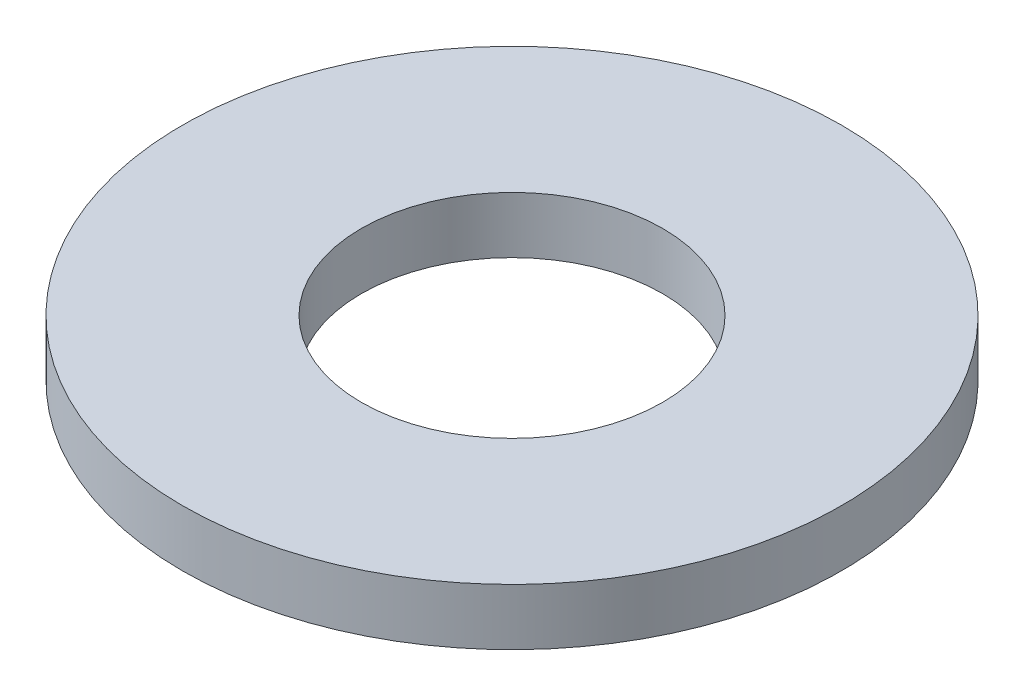
ISO-10303-21;
HEADER;
FILE_DESCRIPTION(('STEP AP214'),'2;1');
FILE_NAME('part.step','',(''),(''),'','','');
FILE_SCHEMA(('AUTOMOTIVE_DESIGN { 1 0 10303 214 1 1 1 1 }'));
ENDSEC;
DATA;
#1=APPLICATION_CONTEXT('core data for automotive mechanical design processes');
#2=APPLICATION_PROTOCOL_DEFINITION('international standard','automotive_design',2000,#1);
#3=PRODUCT_CONTEXT('',#1,'mechanical');
#4=PRODUCT('Part','Part','',(#3));
#5=PRODUCT_RELATED_PRODUCT_CATEGORY('part','',(#4));
#6=PRODUCT_DEFINITION_FORMATION('','',#4);
#7=PRODUCT_DEFINITION_CONTEXT('part definition',#1,'design');
#8=PRODUCT_DEFINITION('design','',#6,#7);
#9=PRODUCT_DEFINITION_SHAPE('','',#8);
#10=(LENGTH_UNIT() NAMED_UNIT(*) SI_UNIT(.MILLI.,.METRE.));
#11=(NAMED_UNIT(*) PLANE_ANGLE_UNIT() SI_UNIT($,.RADIAN.));
#12=(NAMED_UNIT(*) SI_UNIT($,.STERADIAN.) SOLID_ANGLE_UNIT());
#13=UNCERTAINTY_MEASURE_WITH_UNIT(LENGTH_MEASURE(1.E-05),#10,'distance_accuracy_value','');
#14=(GEOMETRIC_REPRESENTATION_CONTEXT(3) GLOBAL_UNCERTAINTY_ASSIGNED_CONTEXT((#13)) GLOBAL_UNIT_ASSIGNED_CONTEXT((#10,
#11,#12)) REPRESENTATION_CONTEXT('',''));
#15=CARTESIAN_POINT('',(0.,0.,0.));
#16=DIRECTION('',(0.,0.,1.));
#17=DIRECTION('',(1.,0.,0.));
#18=AXIS2_PLACEMENT_3D('',#15,#16,#17);
#19=CARTESIAN_POINT('',(0.,0.,0.));
#20=DIRECTION('',(0.,-1.,0.));
#21=DIRECTION('',(0.,0.,-1.));
#22=AXIS2_PLACEMENT_3D('',#19,#20,#21);
#23=CYLINDRICAL_SURFACE('',#22,7.);
#24=CARTESIAN_POINT('',(0.,1.2,0.));
#25=DIRECTION('',(0.,-1.,0.));
#26=DIRECTION('',(0.,0.,-1.));
#27=AXIS2_PLACEMENT_3D('',#24,#25,#26);
#28=CIRCLE('',#27,7.);
#29=CARTESIAN_POINT('',(0.,1.2,-7.));
#30=VERTEX_POINT('',#29);
#31=EDGE_CURVE('E10',#30,#30,#28,.T.);
#32=ORIENTED_EDGE('',*,*,#31,.T.);
#33=EDGE_LOOP('',(#32));
#34=FACE_BOUND('',#33,.T.);
#35=CARTESIAN_POINT('',(0.,0.,0.));
#36=DIRECTION('',(0.,-1.,0.));
#37=DIRECTION('',(0.,0.,-1.));
#38=AXIS2_PLACEMENT_3D('',#35,#36,#37);
#39=CIRCLE('',#38,7.);
#40=CARTESIAN_POINT('',(0.,0.,-7.));
#41=VERTEX_POINT('',#40);
#42=EDGE_CURVE('E46',#41,#41,#39,.T.);
#43=ORIENTED_EDGE('',*,*,#42,.F.);
#44=EDGE_LOOP('',(#43));
#45=FACE_BOUND('',#44,.T.);
#46=ADVANCED_FACE('F32',(#34,#45),#23,.T.);
#47=CARTESIAN_POINT('',(7.,1.2,0.));
#48=DIRECTION('',(0.,1.,0.));
#49=DIRECTION('',(0.,0.,1.));
#50=AXIS2_PLACEMENT_3D('',#47,#48,#49);
#51=PLANE('',#50);
#52=CARTESIAN_POINT('',(0.,1.2,0.));
#53=DIRECTION('',(0.,-1.,0.));
#54=DIRECTION('',(0.,0.,-1.));
#55=AXIS2_PLACEMENT_3D('',#52,#53,#54);
#56=CIRCLE('',#55,3.2);
#57=CARTESIAN_POINT('',(0.,1.2,-3.2));
#58=VERTEX_POINT('',#57);
#59=EDGE_CURVE('E38',#58,#58,#56,.T.);
#60=ORIENTED_EDGE('',*,*,#59,.T.);
#61=EDGE_LOOP('',(#60));
#62=FACE_BOUND('',#61,.T.);
#63=ORIENTED_EDGE('',*,*,#31,.F.);
#64=EDGE_LOOP('',(#63));
#65=FACE_BOUND('',#64,.T.);
#66=ADVANCED_FACE('F56',(#62,#65),#51,.T.);
#67=CARTESIAN_POINT('',(0.,0.,0.));
#68=DIRECTION('',(0.,-1.,0.));
#69=DIRECTION('',(0.,0.,-1.));
#70=AXIS2_PLACEMENT_3D('',#67,#68,#69);
#71=CYLINDRICAL_SURFACE('',#70,3.2);
#72=CARTESIAN_POINT('',(0.,0.,0.));
#73=DIRECTION('',(0.,-1.,0.));
#74=DIRECTION('',(0.,0.,-1.));
#75=AXIS2_PLACEMENT_3D('',#72,#73,#74);
#76=CIRCLE('',#75,3.2);
#77=CARTESIAN_POINT('',(0.,0.,-3.2));
#78=VERTEX_POINT('',#77);
#79=EDGE_CURVE('E42',#78,#78,#76,.T.);
#80=ORIENTED_EDGE('',*,*,#79,.T.);
#81=EDGE_LOOP('',(#80));
#82=FACE_BOUND('',#81,.T.);
#83=ORIENTED_EDGE('',*,*,#59,.F.);
#84=EDGE_LOOP('',(#83));
#85=FACE_BOUND('',#84,.T.);
#86=ADVANCED_FACE('F60',(#82,#85),#71,.F.);
#87=CARTESIAN_POINT('',(3.2,0.,0.));
#88=DIRECTION('',(0.,-1.,0.));
#89=DIRECTION('',(0.,0.,-1.));
#90=AXIS2_PLACEMENT_3D('',#87,#88,#89);
#91=PLANE('',#90);
#92=ORIENTED_EDGE('',*,*,#42,.T.);
#93=EDGE_LOOP('',(#92));
#94=FACE_BOUND('',#93,.T.);
#95=ORIENTED_EDGE('',*,*,#79,.F.);
#96=EDGE_LOOP('',(#95));
#97=FACE_BOUND('',#96,.T.);
#98=ADVANCED_FACE('F52',(#94,#97),#91,.T.);
#99=CLOSED_SHELL('',(#46,#66,#86,#98));
#100=MANIFOLD_SOLID_BREP('B2',#99);
#101=ADVANCED_BREP_SHAPE_REPRESENTATION('',(#18,#100),#14);
#102=SHAPE_DEFINITION_REPRESENTATION(#9,#101);
ENDSEC;
END-ISO-10303-21;
